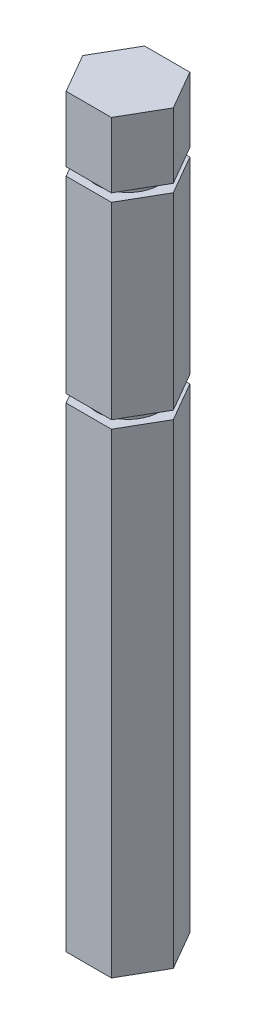
ISO-10303-21;
HEADER;
FILE_DESCRIPTION(('STEP AP214'),'2;1');
FILE_NAME('part.step','',(''),(''),'','','');
FILE_SCHEMA(('AUTOMOTIVE_DESIGN { 1 0 10303 214 1 1 1 1 }'));
ENDSEC;
DATA;
#1=APPLICATION_CONTEXT('core data for automotive mechanical design processes');
#2=APPLICATION_PROTOCOL_DEFINITION('international standard','automotive_design',2000,#1);
#3=PRODUCT_CONTEXT('',#1,'mechanical');
#4=PRODUCT('Part','Part','',(#3));
#5=PRODUCT_RELATED_PRODUCT_CATEGORY('part','',(#4));
#6=PRODUCT_DEFINITION_FORMATION('','',#4);
#7=PRODUCT_DEFINITION_CONTEXT('part definition',#1,'design');
#8=PRODUCT_DEFINITION('design','',#6,#7);
#9=PRODUCT_DEFINITION_SHAPE('','',#8);
#10=(LENGTH_UNIT() NAMED_UNIT(*) SI_UNIT(.MILLI.,.METRE.));
#11=(NAMED_UNIT(*) PLANE_ANGLE_UNIT() SI_UNIT($,.RADIAN.));
#12=(NAMED_UNIT(*) SI_UNIT($,.STERADIAN.) SOLID_ANGLE_UNIT());
#13=UNCERTAINTY_MEASURE_WITH_UNIT(LENGTH_MEASURE(1.E-05),#10,'distance_accuracy_value','');
#14=(GEOMETRIC_REPRESENTATION_CONTEXT(3) GLOBAL_UNCERTAINTY_ASSIGNED_CONTEXT((#13)) GLOBAL_UNIT_ASSIGNED_CONTEXT((#10,
#11,#12)) REPRESENTATION_CONTEXT('',''));
#15=CARTESIAN_POINT('',(0.,0.,0.));
#16=DIRECTION('',(0.,0.,1.));
#17=DIRECTION('',(1.,0.,0.));
#18=AXIS2_PLACEMENT_3D('',#15,#16,#17);
#19=CARTESIAN_POINT('',(0.,90.3732,0.));
#20=DIRECTION('',(0.,1.,0.));
#21=DIRECTION('',(0.,0.,1.));
#22=AXIS2_PLACEMENT_3D('',#19,#20,#21);
#23=PLANE('',#22);
#24=DIRECTION('',(-0.500000000000007,0.,-0.866025403784435));
#25=VECTOR('',#24,1.);
#26=CARTESIAN_POINT('',(-5.49192896561248,90.3732,0.));
#27=LINE('',#26,#25);
#28=CARTESIAN_POINT('',(-5.49192896561248,90.3732,0.));
#29=VERTEX_POINT('',#28);
#30=CARTESIAN_POINT('',(-2.7459644828062,90.3732,4.75615000000003));
#31=VERTEX_POINT('',#30);
#32=EDGE_CURVE('E138',#29,#31,#27,.F.);
#33=ORIENTED_EDGE('',*,*,#32,.T.);
#34=DIRECTION('',(-1.,0.,0.));
#35=VECTOR('',#34,1.);
#36=CARTESIAN_POINT('',(-2.7459644828062,90.3732,4.75615000000003));
#37=LINE('',#36,#35);
#38=CARTESIAN_POINT('',(2.74596448280629,90.3732,4.75614999999998));
#39=VERTEX_POINT('',#38);
#40=EDGE_CURVE('E144',#31,#39,#37,.F.);
#41=ORIENTED_EDGE('',*,*,#40,.T.);
#42=DIRECTION('',(-0.499999999999995,0.,0.866025403784442));
#43=VECTOR('',#42,1.);
#44=CARTESIAN_POINT('',(2.7459644828063,90.3732,4.75614999999997));
#45=LINE('',#44,#43);
#46=CARTESIAN_POINT('',(5.49192896561248,90.3732,0.));
#47=VERTEX_POINT('',#46);
#48=EDGE_CURVE('E201',#39,#47,#45,.F.);
#49=ORIENTED_EDGE('',*,*,#48,.T.);
#50=DIRECTION('',(0.500000000000001,0.,0.866025403784438));
#51=VECTOR('',#50,1.);
#52=CARTESIAN_POINT('',(5.49192896561248,90.3732,0.));
#53=LINE('',#52,#51);
#54=CARTESIAN_POINT('',(2.74596448280623,90.3732,-4.75615000000001));
#55=VERTEX_POINT('',#54);
#56=EDGE_CURVE('E207',#47,#55,#53,.F.);
#57=ORIENTED_EDGE('',*,*,#56,.T.);
#58=DIRECTION('',(1.,0.,0.));
#59=VECTOR('',#58,1.);
#60=CARTESIAN_POINT('',(2.74596448280623,90.3732,-4.75615000000001));
#61=LINE('',#60,#59);
#62=CARTESIAN_POINT('',(-2.74596448280626,90.3732,-4.75615));
#63=VERTEX_POINT('',#62);
#64=EDGE_CURVE('E213',#55,#63,#61,.F.);
#65=ORIENTED_EDGE('',*,*,#64,.T.);
#66=DIRECTION('',(0.499999999999995,0.,-0.866025403784442));
#67=VECTOR('',#66,1.);
#68=CARTESIAN_POINT('',(-2.74596448280626,90.3732,-4.75614999999999));
#69=LINE('',#68,#67);
#70=EDGE_CURVE('E156',#63,#29,#69,.F.);
#71=ORIENTED_EDGE('',*,*,#70,.T.);
#72=EDGE_LOOP('',(#33,#41,#49,#57,#65,#71));
#73=FACE_BOUND('',#72,.T.);
#74=ADVANCED_FACE('F16',(#73),#23,.T.);
#75=CARTESIAN_POINT('',(-2.7459644828062,90.3732,4.75615000000003));
#76=DIRECTION('',(0.,0.,-1.));
#77=DIRECTION('',(-1.,0.,0.));
#78=AXIS2_PLACEMENT_3D('',#75,#76,#77);
#79=PLANE('',#78);
#80=DIRECTION('',(0.,1.,0.));
#81=VECTOR('',#80,1.);
#82=CARTESIAN_POINT('',(2.7459644828063,90.3732,4.75614999999997));
#83=LINE('',#82,#81);
#84=CARTESIAN_POINT('',(2.7459644828063,82.4484,4.75614999999997));
#85=VERTEX_POINT('',#84);
#86=EDGE_CURVE('E149',#85,#39,#83,.T.);
#87=ORIENTED_EDGE('',*,*,#86,.T.);
#88=ORIENTED_EDGE('',*,*,#40,.F.);
#89=DIRECTION('',(0.,1.,0.));
#90=VECTOR('',#89,1.);
#91=CARTESIAN_POINT('',(-2.7459644828062,90.3732,4.75615000000003));
#92=LINE('',#91,#90);
#93=CARTESIAN_POINT('',(-2.7459644828062,82.4484,4.75615000000001));
#94=VERTEX_POINT('',#93);
#95=EDGE_CURVE('E147',#31,#94,#92,.F.);
#96=ORIENTED_EDGE('',*,*,#95,.T.);
#97=DIRECTION('',(1.,0.,0.));
#98=VECTOR('',#97,1.);
#99=CARTESIAN_POINT('',(3.8481,82.4484,4.75614999999997));
#100=LINE('',#99,#98);
#101=EDGE_CURVE('E196',#85,#94,#100,.F.);
#102=ORIENTED_EDGE('',*,*,#101,.F.);
#103=EDGE_LOOP('',(#87,#88,#96,#102));
#104=FACE_BOUND('',#103,.T.);
#105=ADVANCED_FACE('F145',(#104),#79,.F.);
#106=CARTESIAN_POINT('',(-5.49192896561248,90.3732,0.));
#107=DIRECTION('',(0.866025403784435,0.,-0.500000000000007));
#108=DIRECTION('',(-0.500000000000007,0.,-0.866025403784435));
#109=AXIS2_PLACEMENT_3D('',#106,#107,#108);
#110=PLANE('',#109);
#111=ORIENTED_EDGE('',*,*,#95,.F.);
#112=ORIENTED_EDGE('',*,*,#32,.F.);
#113=DIRECTION('',(0.,1.,0.));
#114=VECTOR('',#113,1.);
#115=CARTESIAN_POINT('',(-5.49192896561248,90.3732,0.));
#116=LINE('',#115,#114);
#117=CARTESIAN_POINT('',(-5.49192896561248,82.4484,0.));
#118=VERTEX_POINT('',#117);
#119=EDGE_CURVE('E215',#29,#118,#116,.F.);
#120=ORIENTED_EDGE('',*,*,#119,.T.);
#121=DIRECTION('',(-0.500000000000007,0.,-0.866025403784434));
#122=VECTOR('',#121,1.);
#123=CARTESIAN_POINT('',(-2.7459644828062,82.4484,4.75615000000003));
#124=LINE('',#123,#122);
#125=EDGE_CURVE('E155',#94,#118,#124,.T.);
#126=ORIENTED_EDGE('',*,*,#125,.F.);
#127=EDGE_LOOP('',(#111,#112,#120,#126));
#128=FACE_BOUND('',#127,.T.);
#129=ADVANCED_FACE('F154',(#128),#110,.F.);
#130=CARTESIAN_POINT('',(-2.74596448280626,90.3732,-4.75614999999999));
#131=DIRECTION('',(0.866025403784442,0.,0.499999999999995));
#132=DIRECTION('',(0.499999999999995,0.,-0.866025403784442));
#133=AXIS2_PLACEMENT_3D('',#130,#131,#132);
#134=PLANE('',#133);
#135=ORIENTED_EDGE('',*,*,#119,.F.);
#136=ORIENTED_EDGE('',*,*,#70,.F.);
#137=DIRECTION('',(0.,1.,0.));
#138=VECTOR('',#137,1.);
#139=CARTESIAN_POINT('',(-2.74596448280626,90.3732,-4.75614999999999));
#140=LINE('',#139,#138);
#141=CARTESIAN_POINT('',(-2.74596448280626,82.4484,-4.75614999999999));
#142=VERTEX_POINT('',#141);
#143=EDGE_CURVE('E210',#63,#142,#140,.F.);
#144=ORIENTED_EDGE('',*,*,#143,.T.);
#145=DIRECTION('',(0.499999999999995,0.,-0.866025403784442));
#146=VECTOR('',#145,1.);
#147=CARTESIAN_POINT('',(-5.49192896561248,82.4484,0.));
#148=LINE('',#147,#146);
#149=EDGE_CURVE('E193',#118,#142,#148,.T.);
#150=ORIENTED_EDGE('',*,*,#149,.F.);
#151=EDGE_LOOP('',(#135,#136,#144,#150));
#152=FACE_BOUND('',#151,.T.);
#153=ADVANCED_FACE('F218',(#152),#134,.F.);
#154=CARTESIAN_POINT('',(2.74596448280623,90.3732,-4.75615000000001));
#155=DIRECTION('',(0.,0.,1.));
#156=DIRECTION('',(1.,0.,0.));
#157=AXIS2_PLACEMENT_3D('',#154,#155,#156);
#158=PLANE('',#157);
#159=ORIENTED_EDGE('',*,*,#143,.F.);
#160=ORIENTED_EDGE('',*,*,#64,.F.);
#161=DIRECTION('',(0.,1.,0.));
#162=VECTOR('',#161,1.);
#163=CARTESIAN_POINT('',(2.74596448280623,90.3732,-4.75615000000001));
#164=LINE('',#163,#162);
#165=CARTESIAN_POINT('',(2.74596448280623,82.4484,-4.75615));
#166=VERTEX_POINT('',#165);
#167=EDGE_CURVE('E204',#55,#166,#164,.F.);
#168=ORIENTED_EDGE('',*,*,#167,.T.);
#169=DIRECTION('',(1.,0.,0.));
#170=VECTOR('',#169,1.);
#171=CARTESIAN_POINT('',(3.8481,82.4484,-4.75614999999999));
#172=LINE('',#171,#170);
#173=EDGE_CURVE('E188',#142,#166,#172,.T.);
#174=ORIENTED_EDGE('',*,*,#173,.F.);
#175=EDGE_LOOP('',(#159,#160,#168,#174));
#176=FACE_BOUND('',#175,.T.);
#177=ADVANCED_FACE('F226',(#176),#158,.F.);
#178=CARTESIAN_POINT('',(5.49192896561248,90.3732,0.));
#179=DIRECTION('',(-0.866025403784438,0.,0.500000000000001));
#180=DIRECTION('',(0.500000000000001,0.,0.866025403784438));
#181=AXIS2_PLACEMENT_3D('',#178,#179,#180);
#182=PLANE('',#181);
#183=ORIENTED_EDGE('',*,*,#167,.F.);
#184=ORIENTED_EDGE('',*,*,#56,.F.);
#185=DIRECTION('',(0.,1.,0.));
#186=VECTOR('',#185,1.);
#187=CARTESIAN_POINT('',(5.49192896561248,90.3732,0.));
#188=LINE('',#187,#186);
#189=CARTESIAN_POINT('',(5.49192896561248,82.4484,0.));
#190=VERTEX_POINT('',#189);
#191=EDGE_CURVE('E198',#47,#190,#188,.F.);
#192=ORIENTED_EDGE('',*,*,#191,.T.);
#193=DIRECTION('',(0.500000000000001,0.,0.866025403784438));
#194=VECTOR('',#193,1.);
#195=CARTESIAN_POINT('',(2.74596448280623,82.4484,-4.75615000000001));
#196=LINE('',#195,#194);
#197=EDGE_CURVE('E184',#166,#190,#196,.T.);
#198=ORIENTED_EDGE('',*,*,#197,.F.);
#199=EDGE_LOOP('',(#183,#184,#192,#198));
#200=FACE_BOUND('',#199,.T.);
#201=ADVANCED_FACE('F228',(#200),#182,.F.);
#202=CARTESIAN_POINT('',(2.7459644828063,90.3732,4.75614999999997));
#203=DIRECTION('',(-0.866025403784442,0.,-0.499999999999995));
#204=DIRECTION('',(-0.499999999999995,0.,0.866025403784442));
#205=AXIS2_PLACEMENT_3D('',#202,#203,#204);
#206=PLANE('',#205);
#207=ORIENTED_EDGE('',*,*,#191,.F.);
#208=ORIENTED_EDGE('',*,*,#48,.F.);
#209=ORIENTED_EDGE('',*,*,#86,.F.);
#210=DIRECTION('',(-0.499999999999995,0.,0.866025403784442));
#211=VECTOR('',#210,1.);
#212=CARTESIAN_POINT('',(5.49192896561248,82.4484,0.));
#213=LINE('',#212,#211);
#214=EDGE_CURVE('E180',#190,#85,#213,.T.);
#215=ORIENTED_EDGE('',*,*,#214,.F.);
#216=EDGE_LOOP('',(#207,#208,#209,#215));
#217=FACE_BOUND('',#216,.T.);
#218=ADVANCED_FACE('F231',(#217),#206,.F.);
#219=CARTESIAN_POINT('',(3.8481,82.4484,0.));
#220=DIRECTION('',(0.,-1.,0.));
#221=DIRECTION('',(0.,0.,-1.));
#222=AXIS2_PLACEMENT_3D('',#219,#220,#221);
#223=PLANE('',#222);
#224=ORIENTED_EDGE('',*,*,#197,.T.);
#225=ORIENTED_EDGE('',*,*,#214,.T.);
#226=ORIENTED_EDGE('',*,*,#101,.T.);
#227=ORIENTED_EDGE('',*,*,#125,.T.);
#228=ORIENTED_EDGE('',*,*,#149,.T.);
#229=ORIENTED_EDGE('',*,*,#173,.T.);
#230=EDGE_LOOP('',(#224,#225,#226,#227,#228,#229));
#231=FACE_BOUND('',#230,.T.);
#232=CARTESIAN_POINT('',(0.,82.4484,0.));
#233=DIRECTION('',(0.,1.,0.));
#234=DIRECTION('',(0.,0.,1.));
#235=AXIS2_PLACEMENT_3D('',#232,#233,#234);
#236=CIRCLE('',#235,3.8481);
#237=CARTESIAN_POINT('',(0.,82.4484,3.8481));
#238=VERTEX_POINT('',#237);
#239=EDGE_CURVE('E19',#238,#238,#236,.F.);
#240=ORIENTED_EDGE('',*,*,#239,.F.);
#241=EDGE_LOOP('',(#240));
#242=FACE_BOUND('',#241,.T.);
#243=ADVANCED_FACE('F221',(#231,#242),#223,.T.);
#244=CARTESIAN_POINT('',(0.,88.5049982362318,0.));
#245=DIRECTION('',(0.,1.,0.));
#246=DIRECTION('',(0.,0.,1.));
#247=AXIS2_PLACEMENT_3D('',#244,#245,#246);
#248=CYLINDRICAL_SURFACE('',#247,3.8481);
#249=CARTESIAN_POINT('',(0.,81.4578,0.));
#250=DIRECTION('',(0.,1.,0.));
#251=DIRECTION('',(0.,0.,1.));
#252=AXIS2_PLACEMENT_3D('',#249,#250,#251);
#253=CIRCLE('',#252,3.8481);
#254=CARTESIAN_POINT('',(0.,81.4578,3.8481));
#255=VERTEX_POINT('',#254);
#256=EDGE_CURVE('E172',#255,#255,#253,.F.);
#257=ORIENTED_EDGE('',*,*,#256,.F.);
#258=EDGE_LOOP('',(#257));
#259=FACE_BOUND('',#258,.T.);
#260=ORIENTED_EDGE('',*,*,#239,.T.);
#261=EDGE_LOOP('',(#260));
#262=FACE_BOUND('',#261,.T.);
#263=ADVANCED_FACE('F239',(#259,#262),#248,.T.);
#264=CARTESIAN_POINT('',(3.8481,81.4578,0.));
#265=DIRECTION('',(0.,1.,0.));
#266=DIRECTION('',(0.,0.,1.));
#267=AXIS2_PLACEMENT_3D('',#264,#265,#266);
#268=PLANE('',#267);
#269=DIRECTION('',(0.499999999999995,0.,-0.866025403784442));
#270=VECTOR('',#269,1.);
#271=CARTESIAN_POINT('',(-2.74596448280626,81.4578,-4.75614999999999));
#272=LINE('',#271,#270);
#273=CARTESIAN_POINT('',(-2.74596448280626,81.4578,-4.75615));
#274=VERTEX_POINT('',#273);
#275=CARTESIAN_POINT('',(-5.49192896561248,81.4578,0.));
#276=VERTEX_POINT('',#275);
#277=EDGE_CURVE('E490',#274,#276,#272,.F.);
#278=ORIENTED_EDGE('',*,*,#277,.T.);
#279=DIRECTION('',(-0.500000000000007,0.,-0.866025403784435));
#280=VECTOR('',#279,1.);
#281=CARTESIAN_POINT('',(-5.49192896561248,81.4578,0.));
#282=LINE('',#281,#280);
#283=CARTESIAN_POINT('',(-2.7459644828062,81.4578,4.75615000000003));
#284=VERTEX_POINT('',#283);
#285=EDGE_CURVE('E492',#276,#284,#282,.F.);
#286=ORIENTED_EDGE('',*,*,#285,.T.);
#287=DIRECTION('',(-1.,0.,0.));
#288=VECTOR('',#287,1.);
#289=CARTESIAN_POINT('',(-2.7459644828062,81.4578,4.75615000000003));
#290=LINE('',#289,#288);
#291=CARTESIAN_POINT('',(2.74596448280629,81.4578,4.75614999999998));
#292=VERTEX_POINT('',#291);
#293=EDGE_CURVE('E510',#284,#292,#290,.F.);
#294=ORIENTED_EDGE('',*,*,#293,.T.);
#295=DIRECTION('',(-0.499999999999995,0.,0.866025403784442));
#296=VECTOR('',#295,1.);
#297=CARTESIAN_POINT('',(2.7459644828063,81.4578,4.75614999999997));
#298=LINE('',#297,#296);
#299=CARTESIAN_POINT('',(5.49192896561248,81.4578,0.));
#300=VERTEX_POINT('',#299);
#301=EDGE_CURVE('E174',#292,#300,#298,.F.);
#302=ORIENTED_EDGE('',*,*,#301,.T.);
#303=DIRECTION('',(0.500000000000001,0.,0.866025403784438));
#304=VECTOR('',#303,1.);
#305=CARTESIAN_POINT('',(5.49192896561248,81.4578,0.));
#306=LINE('',#305,#304);
#307=CARTESIAN_POINT('',(2.74596448280623,81.4578,-4.75615000000001));
#308=VERTEX_POINT('',#307);
#309=EDGE_CURVE('E524',#300,#308,#306,.F.);
#310=ORIENTED_EDGE('',*,*,#309,.T.);
#311=DIRECTION('',(1.,0.,0.));
#312=VECTOR('',#311,1.);
#313=CARTESIAN_POINT('',(2.74596448280623,81.4578,-4.75615000000001));
#314=LINE('',#313,#312);
#315=EDGE_CURVE('E494',#308,#274,#314,.F.);
#316=ORIENTED_EDGE('',*,*,#315,.T.);
#317=EDGE_LOOP('',(#278,#286,#294,#302,#310,#316));
#318=FACE_BOUND('',#317,.T.);
#319=ORIENTED_EDGE('',*,*,#256,.T.);
#320=EDGE_LOOP('',(#319));
#321=FACE_BOUND('',#320,.T.);
#322=ADVANCED_FACE('F308',(#318,#321),#268,.T.);
#323=CARTESIAN_POINT('',(2.7459644828063,90.3732,4.75614999999997));
#324=DIRECTION('',(-0.866025403784442,0.,-0.499999999999995));
#325=DIRECTION('',(-0.499999999999995,0.,0.866025403784442));
#326=AXIS2_PLACEMENT_3D('',#323,#324,#325);
#327=PLANE('',#326);
#328=DIRECTION('',(0.,1.,0.));
#329=VECTOR('',#328,1.);
#330=CARTESIAN_POINT('',(2.7459644828063,90.3732,4.75614999999997));
#331=LINE('',#330,#329);
#332=CARTESIAN_POINT('',(2.7459644828063,58.6232,4.75614999999997));
#333=VERTEX_POINT('',#332);
#334=EDGE_CURVE('E177',#292,#333,#331,.F.);
#335=ORIENTED_EDGE('',*,*,#334,.T.);
#336=DIRECTION('',(-0.499999999999995,0.,0.866025403784442));
#337=VECTOR('',#336,1.);
#338=CARTESIAN_POINT('',(5.49192896561248,58.6232,0.));
#339=LINE('',#338,#337);
#340=CARTESIAN_POINT('',(5.49192896561248,58.6232,0.));
#341=VERTEX_POINT('',#340);
#342=EDGE_CURVE('E516',#341,#333,#339,.T.);
#343=ORIENTED_EDGE('',*,*,#342,.F.);
#344=DIRECTION('',(0.,1.,0.));
#345=VECTOR('',#344,1.);
#346=CARTESIAN_POINT('',(5.49192896561248,90.3732,0.));
#347=LINE('',#346,#345);
#348=EDGE_CURVE('E529',#341,#300,#347,.T.);
#349=ORIENTED_EDGE('',*,*,#348,.T.);
#350=ORIENTED_EDGE('',*,*,#301,.F.);
#351=EDGE_LOOP('',(#335,#343,#349,#350));
#352=FACE_BOUND('',#351,.T.);
#353=ADVANCED_FACE('F304',(#352),#327,.F.);
#354=CARTESIAN_POINT('',(-2.7459644828062,90.3732,4.75615000000003));
#355=DIRECTION('',(0.,0.,-1.));
#356=DIRECTION('',(-1.,0.,0.));
#357=AXIS2_PLACEMENT_3D('',#354,#355,#356);
#358=PLANE('',#357);
#359=DIRECTION('',(0.,1.,0.));
#360=VECTOR('',#359,1.);
#361=CARTESIAN_POINT('',(-2.7459644828062,90.3732,4.75615000000003));
#362=LINE('',#361,#360);
#363=CARTESIAN_POINT('',(-2.7459644828062,58.6232,4.75615000000001));
#364=VERTEX_POINT('',#363);
#365=EDGE_CURVE('E507',#284,#364,#362,.F.);
#366=ORIENTED_EDGE('',*,*,#365,.T.);
#367=DIRECTION('',(1.,0.,0.));
#368=VECTOR('',#367,1.);
#369=CARTESIAN_POINT('',(3.8481,58.6232,4.75614999999997));
#370=LINE('',#369,#368);
#371=EDGE_CURVE('E517',#333,#364,#370,.F.);
#372=ORIENTED_EDGE('',*,*,#371,.F.);
#373=ORIENTED_EDGE('',*,*,#334,.F.);
#374=ORIENTED_EDGE('',*,*,#293,.F.);
#375=EDGE_LOOP('',(#366,#372,#373,#374));
#376=FACE_BOUND('',#375,.T.);
#377=ADVANCED_FACE('F300',(#376),#358,.F.);
#378=CARTESIAN_POINT('',(-5.49192896561248,90.3732,0.));
#379=DIRECTION('',(0.866025403784435,0.,-0.500000000000007));
#380=DIRECTION('',(-0.500000000000007,0.,-0.866025403784435));
#381=AXIS2_PLACEMENT_3D('',#378,#379,#380);
#382=PLANE('',#381);
#383=DIRECTION('',(0.,1.,0.));
#384=VECTOR('',#383,1.);
#385=CARTESIAN_POINT('',(-5.49192896561248,90.3732,0.));
#386=LINE('',#385,#384);
#387=CARTESIAN_POINT('',(-5.49192896561248,58.6232,0.));
#388=VERTEX_POINT('',#387);
#389=EDGE_CURVE('E499',#276,#388,#386,.F.);
#390=ORIENTED_EDGE('',*,*,#389,.T.);
#391=DIRECTION('',(-0.500000000000007,0.,-0.866025403784435));
#392=VECTOR('',#391,1.);
#393=CARTESIAN_POINT('',(-2.7459644828062,58.6232,4.75615000000003));
#394=LINE('',#393,#392);
#395=EDGE_CURVE('E520',#364,#388,#394,.T.);
#396=ORIENTED_EDGE('',*,*,#395,.F.);
#397=ORIENTED_EDGE('',*,*,#365,.F.);
#398=ORIENTED_EDGE('',*,*,#285,.F.);
#399=EDGE_LOOP('',(#390,#396,#397,#398));
#400=FACE_BOUND('',#399,.T.);
#401=ADVANCED_FACE('F296',(#400),#382,.F.);
#402=CARTESIAN_POINT('',(-2.74596448280626,90.3732,-4.75614999999999));
#403=DIRECTION('',(0.866025403784442,0.,0.499999999999995));
#404=DIRECTION('',(0.499999999999995,0.,-0.866025403784442));
#405=AXIS2_PLACEMENT_3D('',#402,#403,#404);
#406=PLANE('',#405);
#407=DIRECTION('',(0.,1.,0.));
#408=VECTOR('',#407,1.);
#409=CARTESIAN_POINT('',(-2.74596448280626,90.3732,-4.75614999999999));
#410=LINE('',#409,#408);
#411=CARTESIAN_POINT('',(-2.74596448280626,58.6232,-4.75614999999999));
#412=VERTEX_POINT('',#411);
#413=EDGE_CURVE('E498',#274,#412,#410,.F.);
#414=ORIENTED_EDGE('',*,*,#413,.T.);
#415=DIRECTION('',(0.499999999999995,0.,-0.866025403784442));
#416=VECTOR('',#415,1.);
#417=CARTESIAN_POINT('',(-5.49192896561248,58.6232,0.));
#418=LINE('',#417,#416);
#419=EDGE_CURVE('E522',#388,#412,#418,.T.);
#420=ORIENTED_EDGE('',*,*,#419,.F.);
#421=ORIENTED_EDGE('',*,*,#389,.F.);
#422=ORIENTED_EDGE('',*,*,#277,.F.);
#423=EDGE_LOOP('',(#414,#420,#421,#422));
#424=FACE_BOUND('',#423,.T.);
#425=ADVANCED_FACE('F292',(#424),#406,.F.);
#426=CARTESIAN_POINT('',(2.74596448280623,90.3732,-4.75615000000001));
#427=DIRECTION('',(0.,0.,1.));
#428=DIRECTION('',(1.,0.,0.));
#429=AXIS2_PLACEMENT_3D('',#426,#427,#428);
#430=PLANE('',#429);
#431=DIRECTION('',(0.,1.,0.));
#432=VECTOR('',#431,1.);
#433=CARTESIAN_POINT('',(2.74596448280623,90.3732,-4.75615000000001));
#434=LINE('',#433,#432);
#435=CARTESIAN_POINT('',(2.74596448280623,58.6232,-4.75615));
#436=VERTEX_POINT('',#435);
#437=EDGE_CURVE('E531',#308,#436,#434,.F.);
#438=ORIENTED_EDGE('',*,*,#437,.T.);
#439=DIRECTION('',(1.,0.,0.));
#440=VECTOR('',#439,1.);
#441=CARTESIAN_POINT('',(3.8481,58.6232,-4.75614999999999));
#442=LINE('',#441,#440);
#443=EDGE_CURVE('E536',#412,#436,#442,.T.);
#444=ORIENTED_EDGE('',*,*,#443,.F.);
#445=ORIENTED_EDGE('',*,*,#413,.F.);
#446=ORIENTED_EDGE('',*,*,#315,.F.);
#447=EDGE_LOOP('',(#438,#444,#445,#446));
#448=FACE_BOUND('',#447,.T.);
#449=ADVANCED_FACE('F288',(#448),#430,.F.);
#450=CARTESIAN_POINT('',(5.49192896561248,90.3732,0.));
#451=DIRECTION('',(-0.866025403784438,0.,0.500000000000001));
#452=DIRECTION('',(0.500000000000001,0.,0.866025403784438));
#453=AXIS2_PLACEMENT_3D('',#450,#451,#452);
#454=PLANE('',#453);
#455=ORIENTED_EDGE('',*,*,#348,.F.);
#456=DIRECTION('',(0.500000000000001,0.,0.866025403784438));
#457=VECTOR('',#456,1.);
#458=CARTESIAN_POINT('',(2.74596448280623,58.6232,-4.75615000000001));
#459=LINE('',#458,#457);
#460=EDGE_CURVE('E171',#436,#341,#459,.T.);
#461=ORIENTED_EDGE('',*,*,#460,.F.);
#462=ORIENTED_EDGE('',*,*,#437,.F.);
#463=ORIENTED_EDGE('',*,*,#309,.F.);
#464=EDGE_LOOP('',(#455,#461,#462,#463));
#465=FACE_BOUND('',#464,.T.);
#466=ADVANCED_FACE('F284',(#465),#454,.F.);
#467=CARTESIAN_POINT('',(3.8481,58.6232,0.));
#468=DIRECTION('',(0.,-1.,0.));
#469=DIRECTION('',(0.,0.,-1.));
#470=AXIS2_PLACEMENT_3D('',#467,#468,#469);
#471=PLANE('',#470);
#472=ORIENTED_EDGE('',*,*,#443,.T.);
#473=ORIENTED_EDGE('',*,*,#460,.T.);
#474=ORIENTED_EDGE('',*,*,#342,.T.);
#475=ORIENTED_EDGE('',*,*,#371,.T.);
#476=ORIENTED_EDGE('',*,*,#395,.T.);
#477=ORIENTED_EDGE('',*,*,#419,.T.);
#478=EDGE_LOOP('',(#472,#473,#474,#475,#476,#477));
#479=FACE_BOUND('',#478,.T.);
#480=CARTESIAN_POINT('',(0.,58.6232,0.));
#481=DIRECTION('',(0.,1.,0.));
#482=DIRECTION('',(0.,0.,1.));
#483=AXIS2_PLACEMENT_3D('',#480,#481,#482);
#484=CIRCLE('',#483,3.8481);
#485=CARTESIAN_POINT('',(0.,58.6232,3.8481));
#486=VERTEX_POINT('',#485);
#487=EDGE_CURVE('E168',#486,#486,#484,.F.);
#488=ORIENTED_EDGE('',*,*,#487,.F.);
#489=EDGE_LOOP('',(#488));
#490=FACE_BOUND('',#489,.T.);
#491=ADVANCED_FACE('F280',(#479,#490),#471,.T.);
#492=CARTESIAN_POINT('',(0.,88.5049982362318,0.));
#493=DIRECTION('',(0.,1.,0.));
#494=DIRECTION('',(0.,0.,1.));
#495=AXIS2_PLACEMENT_3D('',#492,#493,#494);
#496=CYLINDRICAL_SURFACE('',#495,3.8481);
#497=CARTESIAN_POINT('',(0.,57.6326,0.));
#498=DIRECTION('',(0.,1.,0.));
#499=DIRECTION('',(0.,0.,1.));
#500=AXIS2_PLACEMENT_3D('',#497,#498,#499);
#501=CIRCLE('',#500,3.8481);
#502=CARTESIAN_POINT('',(0.,57.6326,3.8481));
#503=VERTEX_POINT('',#502);
#504=EDGE_CURVE('E163',#503,#503,#501,.F.);
#505=ORIENTED_EDGE('',*,*,#504,.F.);
#506=EDGE_LOOP('',(#505));
#507=FACE_BOUND('',#506,.T.);
#508=ORIENTED_EDGE('',*,*,#487,.T.);
#509=EDGE_LOOP('',(#508));
#510=FACE_BOUND('',#509,.T.);
#511=ADVANCED_FACE('F276',(#507,#510),#496,.T.);
#512=CARTESIAN_POINT('',(5.49192896561248,90.3732,0.));
#513=DIRECTION('',(-0.866025403784438,0.,0.500000000000001));
#514=DIRECTION('',(0.500000000000001,0.,0.866025403784438));
#515=AXIS2_PLACEMENT_3D('',#512,#513,#514);
#516=PLANE('',#515);
#517=DIRECTION('',(0.,1.,0.));
#518=VECTOR('',#517,1.);
#519=CARTESIAN_POINT('',(5.49192896561248,90.3732,0.));
#520=LINE('',#519,#518);
#521=CARTESIAN_POINT('',(5.49192896561248,57.6326,0.));
#522=VERTEX_POINT('',#521);
#523=CARTESIAN_POINT('',(5.49192896561248,0.,0.));
#524=VERTEX_POINT('',#523);
#525=EDGE_CURVE('E551',#522,#524,#520,.F.);
#526=ORIENTED_EDGE('',*,*,#525,.T.);
#527=DIRECTION('',(-0.500000000000001,0.,-0.866025403784438));
#528=VECTOR('',#527,1.);
#529=CARTESIAN_POINT('',(5.49192896561248,0.,0.));
#530=LINE('',#529,#528);
#531=CARTESIAN_POINT('',(2.74596448280623,0.,-4.75615000000001));
#532=VERTEX_POINT('',#531);
#533=EDGE_CURVE('E554',#524,#532,#530,.T.);
#534=ORIENTED_EDGE('',*,*,#533,.T.);
#535=DIRECTION('',(0.,1.,0.));
#536=VECTOR('',#535,1.);
#537=CARTESIAN_POINT('',(2.74596448280623,90.3732,-4.75615000000001));
#538=LINE('',#537,#536);
#539=CARTESIAN_POINT('',(2.74596448280623,57.6326,-4.75615000000001));
#540=VERTEX_POINT('',#539);
#541=EDGE_CURVE('E170',#532,#540,#538,.T.);
#542=ORIENTED_EDGE('',*,*,#541,.T.);
#543=DIRECTION('',(-0.500000000000001,0.,-0.866025403784438));
#544=VECTOR('',#543,1.);
#545=CARTESIAN_POINT('',(5.49192896561248,57.6326,0.));
#546=LINE('',#545,#544);
#547=EDGE_CURVE('E572',#522,#540,#546,.T.);
#548=ORIENTED_EDGE('',*,*,#547,.F.);
#549=EDGE_LOOP('',(#526,#534,#542,#548));
#550=FACE_BOUND('',#549,.T.);
#551=ADVANCED_FACE('F272',(#550),#516,.F.);
#552=CARTESIAN_POINT('',(2.74596448280623,90.3732,-4.75615000000001));
#553=DIRECTION('',(0.,0.,1.));
#554=DIRECTION('',(1.,0.,0.));
#555=AXIS2_PLACEMENT_3D('',#552,#553,#554);
#556=PLANE('',#555);
#557=ORIENTED_EDGE('',*,*,#541,.F.);
#558=DIRECTION('',(1.,0.,0.));
#559=VECTOR('',#558,1.);
#560=CARTESIAN_POINT('',(0.,0.,-4.75615000000001));
#561=LINE('',#560,#559);
#562=CARTESIAN_POINT('',(-2.74596448280626,0.,-4.75615));
#563=VERTEX_POINT('',#562);
#564=EDGE_CURVE('E557',#532,#563,#561,.F.);
#565=ORIENTED_EDGE('',*,*,#564,.T.);
#566=DIRECTION('',(0.,1.,0.));
#567=VECTOR('',#566,1.);
#568=CARTESIAN_POINT('',(-2.74596448280626,90.3732,-4.75614999999999));
#569=LINE('',#568,#567);
#570=CARTESIAN_POINT('',(-2.74596448280626,57.6326,-4.75615));
#571=VERTEX_POINT('',#570);
#572=EDGE_CURVE('E548',#563,#571,#569,.T.);
#573=ORIENTED_EDGE('',*,*,#572,.T.);
#574=DIRECTION('',(1.,0.,0.));
#575=VECTOR('',#574,1.);
#576=CARTESIAN_POINT('',(3.8481,57.6326,-4.75615000000001));
#577=LINE('',#576,#575);
#578=EDGE_CURVE('E574',#540,#571,#577,.F.);
#579=ORIENTED_EDGE('',*,*,#578,.F.);
#580=EDGE_LOOP('',(#557,#565,#573,#579));
#581=FACE_BOUND('',#580,.T.);
#582=ADVANCED_FACE('F268',(#581),#556,.F.);
#583=CARTESIAN_POINT('',(-2.74596448280626,90.3732,-4.75614999999999));
#584=DIRECTION('',(0.866025403784442,0.,0.499999999999995));
#585=DIRECTION('',(0.499999999999995,0.,-0.866025403784442));
#586=AXIS2_PLACEMENT_3D('',#583,#584,#585);
#587=PLANE('',#586);
#588=ORIENTED_EDGE('',*,*,#572,.F.);
#589=DIRECTION('',(-0.499999999999995,0.,0.866025403784442));
#590=VECTOR('',#589,1.);
#591=CARTESIAN_POINT('',(-2.74596448280626,0.,-4.75614999999999));
#592=LINE('',#591,#590);
#593=CARTESIAN_POINT('',(-5.49192896561248,0.,0.));
#594=VERTEX_POINT('',#593);
#595=EDGE_CURVE('E560',#563,#594,#592,.T.);
#596=ORIENTED_EDGE('',*,*,#595,.T.);
#597=DIRECTION('',(0.,1.,0.));
#598=VECTOR('',#597,1.);
#599=CARTESIAN_POINT('',(-5.49192896561248,90.3732,0.));
#600=LINE('',#599,#598);
#601=CARTESIAN_POINT('',(-5.49192896561248,57.6326,0.));
#602=VERTEX_POINT('',#601);
#603=EDGE_CURVE('E167',#594,#602,#600,.T.);
#604=ORIENTED_EDGE('',*,*,#603,.T.);
#605=DIRECTION('',(-0.499999999999995,0.,0.866025403784442));
#606=VECTOR('',#605,1.);
#607=CARTESIAN_POINT('',(-2.74596448280626,57.6326,-4.75614999999999));
#608=LINE('',#607,#606);
#609=EDGE_CURVE('E576',#571,#602,#608,.T.);
#610=ORIENTED_EDGE('',*,*,#609,.F.);
#611=EDGE_LOOP('',(#588,#596,#604,#610));
#612=FACE_BOUND('',#611,.T.);
#613=ADVANCED_FACE('F264',(#612),#587,.F.);
#614=CARTESIAN_POINT('',(2.7459644828063,90.3732,4.75614999999997));
#615=DIRECTION('',(-0.866025403784442,0.,-0.499999999999995));
#616=DIRECTION('',(-0.499999999999995,0.,0.866025403784442));
#617=AXIS2_PLACEMENT_3D('',#614,#615,#616);
#618=PLANE('',#617);
#619=DIRECTION('',(0.,1.,0.));
#620=VECTOR('',#619,1.);
#621=CARTESIAN_POINT('',(2.7459644828063,90.3732,4.75614999999997));
#622=LINE('',#621,#620);
#623=CARTESIAN_POINT('',(2.74596448280629,57.6326,4.75614999999998));
#624=VERTEX_POINT('',#623);
#625=CARTESIAN_POINT('',(2.74596448280629,0.,4.75614999999998));
#626=VERTEX_POINT('',#625);
#627=EDGE_CURVE('E579',#624,#626,#622,.F.);
#628=ORIENTED_EDGE('',*,*,#627,.T.);
#629=DIRECTION('',(0.499999999999995,0.,-0.866025403784442));
#630=VECTOR('',#629,1.);
#631=CARTESIAN_POINT('',(2.7459644828063,0.,4.75614999999997));
#632=LINE('',#631,#630);
#633=EDGE_CURVE('E562',#626,#524,#632,.T.);
#634=ORIENTED_EDGE('',*,*,#633,.T.);
#635=ORIENTED_EDGE('',*,*,#525,.F.);
#636=DIRECTION('',(0.499999999999995,0.,-0.866025403784442));
#637=VECTOR('',#636,1.);
#638=CARTESIAN_POINT('',(2.7459644828063,57.6326,4.75614999999997));
#639=LINE('',#638,#637);
#640=EDGE_CURVE('E166',#624,#522,#639,.T.);
#641=ORIENTED_EDGE('',*,*,#640,.F.);
#642=EDGE_LOOP('',(#628,#634,#635,#641));
#643=FACE_BOUND('',#642,.T.);
#644=ADVANCED_FACE('F260',(#643),#618,.F.);
#645=CARTESIAN_POINT('',(0.,0.,0.));
#646=DIRECTION('',(0.,1.,0.));
#647=DIRECTION('',(0.,0.,1.));
#648=AXIS2_PLACEMENT_3D('',#645,#646,#647);
#649=PLANE('',#648);
#650=DIRECTION('',(-1.,0.,0.));
#651=VECTOR('',#650,1.);
#652=CARTESIAN_POINT('',(-2.7459644828062,0.,4.75615000000003));
#653=LINE('',#652,#651);
#654=CARTESIAN_POINT('',(-2.7459644828062,0.,4.75615000000003));
#655=VERTEX_POINT('',#654);
#656=EDGE_CURVE('E582',#626,#655,#653,.T.);
#657=ORIENTED_EDGE('',*,*,#656,.T.);
#658=DIRECTION('',(-0.500000000000007,0.,-0.866025403784435));
#659=VECTOR('',#658,1.);
#660=CARTESIAN_POINT('',(-5.49192896561248,0.,0.));
#661=LINE('',#660,#659);
#662=EDGE_CURVE('E565',#655,#594,#661,.T.);
#663=ORIENTED_EDGE('',*,*,#662,.T.);
#664=ORIENTED_EDGE('',*,*,#595,.F.);
#665=ORIENTED_EDGE('',*,*,#564,.F.);
#666=ORIENTED_EDGE('',*,*,#533,.F.);
#667=ORIENTED_EDGE('',*,*,#633,.F.);
#668=EDGE_LOOP('',(#657,#663,#664,#665,#666,#667));
#669=FACE_BOUND('',#668,.T.);
#670=ADVANCED_FACE('F256',(#669),#649,.F.);
#671=CARTESIAN_POINT('',(-5.49192896561248,90.3732,0.));
#672=DIRECTION('',(0.866025403784435,0.,-0.500000000000007));
#673=DIRECTION('',(-0.500000000000007,0.,-0.866025403784435));
#674=AXIS2_PLACEMENT_3D('',#671,#672,#673);
#675=PLANE('',#674);
#676=ORIENTED_EDGE('',*,*,#603,.F.);
#677=ORIENTED_EDGE('',*,*,#662,.F.);
#678=DIRECTION('',(0.,1.,0.));
#679=VECTOR('',#678,1.);
#680=CARTESIAN_POINT('',(-2.7459644828062,90.3732,4.75615000000003));
#681=LINE('',#680,#679);
#682=CARTESIAN_POINT('',(-2.7459644828062,57.6326,4.75615000000003));
#683=VERTEX_POINT('',#682);
#684=EDGE_CURVE('E25',#655,#683,#681,.T.);
#685=ORIENTED_EDGE('',*,*,#684,.T.);
#686=DIRECTION('',(0.500000000000007,0.,0.866025403784435));
#687=VECTOR('',#686,1.);
#688=CARTESIAN_POINT('',(-5.49192896561248,57.6326,0.));
#689=LINE('',#688,#687);
#690=EDGE_CURVE('E33',#602,#683,#689,.T.);
#691=ORIENTED_EDGE('',*,*,#690,.F.);
#692=EDGE_LOOP('',(#676,#677,#685,#691));
#693=FACE_BOUND('',#692,.T.);
#694=ADVANCED_FACE('F250',(#693),#675,.F.);
#695=CARTESIAN_POINT('',(3.8481,57.6326,0.));
#696=DIRECTION('',(0.,1.,0.));
#697=DIRECTION('',(0.,0.,1.));
#698=AXIS2_PLACEMENT_3D('',#695,#696,#697);
#699=PLANE('',#698);
#700=ORIENTED_EDGE('',*,*,#690,.T.);
#701=DIRECTION('',(-1.,0.,0.));
#702=VECTOR('',#701,1.);
#703=CARTESIAN_POINT('',(-2.7459644828062,57.6326,4.75615000000003));
#704=LINE('',#703,#702);
#705=EDGE_CURVE('E11',#683,#624,#704,.F.);
#706=ORIENTED_EDGE('',*,*,#705,.T.);
#707=ORIENTED_EDGE('',*,*,#640,.T.);
#708=ORIENTED_EDGE('',*,*,#547,.T.);
#709=ORIENTED_EDGE('',*,*,#578,.T.);
#710=ORIENTED_EDGE('',*,*,#609,.T.);
#711=EDGE_LOOP('',(#700,#706,#707,#708,#709,#710));
#712=FACE_BOUND('',#711,.T.);
#713=ORIENTED_EDGE('',*,*,#504,.T.);
#714=EDGE_LOOP('',(#713));
#715=FACE_BOUND('',#714,.T.);
#716=ADVANCED_FACE('F244',(#712,#715),#699,.T.);
#717=CARTESIAN_POINT('',(-2.7459644828062,90.3732,4.75615000000003));
#718=DIRECTION('',(0.,0.,-1.));
#719=DIRECTION('',(-1.,0.,0.));
#720=AXIS2_PLACEMENT_3D('',#717,#718,#719);
#721=PLANE('',#720);
#722=ORIENTED_EDGE('',*,*,#684,.F.);
#723=ORIENTED_EDGE('',*,*,#656,.F.);
#724=ORIENTED_EDGE('',*,*,#627,.F.);
#725=ORIENTED_EDGE('',*,*,#705,.F.);
#726=EDGE_LOOP('',(#722,#723,#724,#725));
#727=FACE_BOUND('',#726,.T.);
#728=ADVANCED_FACE('F242',(#727),#721,.F.);
#729=CLOSED_SHELL('',(#74,#105,#129,#153,#177,#201,#218,#243,#263,#322,#353,#377,#401,#425,#449,
#466,#491,#511,#551,#582,#613,#644,#670,#694,#716,#728));
#730=MANIFOLD_SOLID_BREP('B1',#729);
#731=ADVANCED_BREP_SHAPE_REPRESENTATION('',(#18,#730),#14);
#732=SHAPE_DEFINITION_REPRESENTATION(#9,#731);
ENDSEC;
END-ISO-10303-21;
